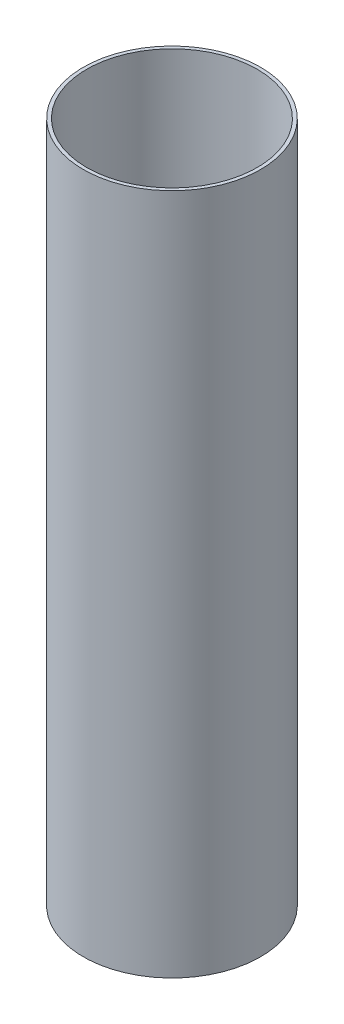
ISO-10303-21;
HEADER;
FILE_DESCRIPTION(('STEP AP214'),'2;1');
FILE_NAME('part.step','',(''),(''),'','','');
FILE_SCHEMA(('AUTOMOTIVE_DESIGN { 1 0 10303 214 1 1 1 1 }'));
ENDSEC;
DATA;
#1=APPLICATION_CONTEXT('core data for automotive mechanical design processes');
#2=APPLICATION_PROTOCOL_DEFINITION('international standard','automotive_design',2000,#1);
#3=PRODUCT_CONTEXT('',#1,'mechanical');
#4=PRODUCT('Part','Part','',(#3));
#5=PRODUCT_RELATED_PRODUCT_CATEGORY('part','',(#4));
#6=PRODUCT_DEFINITION_FORMATION('','',#4);
#7=PRODUCT_DEFINITION_CONTEXT('part definition',#1,'design');
#8=PRODUCT_DEFINITION('design','',#6,#7);
#9=PRODUCT_DEFINITION_SHAPE('','',#8);
#10=(LENGTH_UNIT() NAMED_UNIT(*) SI_UNIT(.MILLI.,.METRE.));
#11=(NAMED_UNIT(*) PLANE_ANGLE_UNIT() SI_UNIT($,.RADIAN.));
#12=(NAMED_UNIT(*) SI_UNIT($,.STERADIAN.) SOLID_ANGLE_UNIT());
#13=UNCERTAINTY_MEASURE_WITH_UNIT(LENGTH_MEASURE(1.E-05),#10,'distance_accuracy_value','');
#14=(GEOMETRIC_REPRESENTATION_CONTEXT(3) GLOBAL_UNCERTAINTY_ASSIGNED_CONTEXT((#13)) GLOBAL_UNIT_ASSIGNED_CONTEXT((#10,
#11,#12)) REPRESENTATION_CONTEXT('',''));
#15=CARTESIAN_POINT('',(0.,0.,0.));
#16=DIRECTION('',(0.,0.,1.));
#17=DIRECTION('',(1.,0.,0.));
#18=AXIS2_PLACEMENT_3D('',#15,#16,#17);
#19=CARTESIAN_POINT('',(0.,304.8,0.));
#20=DIRECTION('',(0.,1.,0.));
#21=DIRECTION('',(0.,0.,1.));
#22=AXIS2_PLACEMENT_3D('',#19,#20,#21);
#23=PLANE('',#22);
#24=CARTESIAN_POINT('',(0.,304.8,0.));
#25=DIRECTION('',(0.,1.,0.));
#26=DIRECTION('',(0.,0.,1.));
#27=AXIS2_PLACEMENT_3D('',#24,#25,#26);
#28=CIRCLE('',#27,39.624);
#29=CARTESIAN_POINT('',(0.,304.8,-39.624));
#30=VERTEX_POINT('',#29);
#31=EDGE_CURVE('E10',#30,#30,#28,.T.);
#32=ORIENTED_EDGE('',*,*,#31,.T.);
#33=EDGE_LOOP('',(#32));
#34=FACE_BOUND('',#33,.T.);
#35=CARTESIAN_POINT('',(0.,304.8,0.));
#36=DIRECTION('',(0.,1.,0.));
#37=DIRECTION('',(0.,0.,1.));
#38=AXIS2_PLACEMENT_3D('',#35,#36,#37);
#39=CIRCLE('',#38,38.1);
#40=CARTESIAN_POINT('',(0.,304.8,-38.1));
#41=VERTEX_POINT('',#40);
#42=EDGE_CURVE('E56',#41,#41,#39,.T.);
#43=ORIENTED_EDGE('',*,*,#42,.F.);
#44=EDGE_LOOP('',(#43));
#45=FACE_BOUND('',#44,.T.);
#46=ADVANCED_FACE('F43',(#34,#45),#23,.T.);
#47=CARTESIAN_POINT('',(0.,0.,0.));
#48=DIRECTION('',(0.,1.,0.));
#49=DIRECTION('',(0.,0.,1.));
#50=AXIS2_PLACEMENT_3D('',#47,#48,#49);
#51=PLANE('',#50);
#52=CARTESIAN_POINT('',(0.,0.,0.));
#53=DIRECTION('',(0.,1.,0.));
#54=DIRECTION('',(0.,0.,1.));
#55=AXIS2_PLACEMENT_3D('',#52,#53,#54);
#56=CIRCLE('',#55,39.624);
#57=CARTESIAN_POINT('',(0.,0.,-39.624));
#58=VERTEX_POINT('',#57);
#59=EDGE_CURVE('E47',#58,#58,#56,.T.);
#60=ORIENTED_EDGE('',*,*,#59,.F.);
#61=EDGE_LOOP('',(#60));
#62=FACE_BOUND('',#61,.T.);
#63=CARTESIAN_POINT('',(0.,0.,0.));
#64=DIRECTION('',(0.,1.,0.));
#65=DIRECTION('',(0.,0.,1.));
#66=AXIS2_PLACEMENT_3D('',#63,#64,#65);
#67=CIRCLE('',#66,38.1);
#68=CARTESIAN_POINT('',(0.,0.,-38.1));
#69=VERTEX_POINT('',#68);
#70=EDGE_CURVE('E58',#69,#69,#67,.T.);
#71=ORIENTED_EDGE('',*,*,#70,.T.);
#72=EDGE_LOOP('',(#71));
#73=FACE_BOUND('',#72,.T.);
#74=ADVANCED_FACE('F70',(#62,#73),#51,.F.);
#75=CARTESIAN_POINT('',(0.,304.8,0.));
#76=DIRECTION('',(0.,-1.,0.));
#77=DIRECTION('',(0.,0.,-1.));
#78=AXIS2_PLACEMENT_3D('',#75,#76,#77);
#79=CYLINDRICAL_SURFACE('',#78,39.624);
#80=CARTESIAN_POINT('',(0.,304.8,-39.624));
#81=CARTESIAN_POINT('',(0.,301.625,-39.624));
#82=CARTESIAN_POINT('',(0.,298.45,-39.624));
#83=CARTESIAN_POINT('',(0.,292.1,-39.624));
#84=CARTESIAN_POINT('',(0.,288.925,-39.624));
#85=CARTESIAN_POINT('',(0.,282.575,-39.624));
#86=CARTESIAN_POINT('',(0.,279.4,-39.624));
#87=CARTESIAN_POINT('',(0.,273.05,-39.624));
#88=CARTESIAN_POINT('',(0.,269.875,-39.624));
#89=CARTESIAN_POINT('',(0.,263.525,-39.624));
#90=CARTESIAN_POINT('',(0.,260.35,-39.624));
#91=CARTESIAN_POINT('',(0.,254.,-39.624));
#92=CARTESIAN_POINT('',(0.,250.825,-39.624));
#93=CARTESIAN_POINT('',(0.,244.475,-39.624));
#94=CARTESIAN_POINT('',(0.,241.3,-39.624));
#95=CARTESIAN_POINT('',(0.,234.95,-39.624));
#96=CARTESIAN_POINT('',(0.,231.775,-39.624));
#97=CARTESIAN_POINT('',(0.,225.425,-39.624));
#98=CARTESIAN_POINT('',(0.,222.25,-39.624));
#99=CARTESIAN_POINT('',(0.,215.9,-39.624));
#100=CARTESIAN_POINT('',(0.,212.725,-39.624));
#101=CARTESIAN_POINT('',(0.,206.375,-39.624));
#102=CARTESIAN_POINT('',(0.,203.2,-39.624));
#103=CARTESIAN_POINT('',(0.,196.85,-39.624));
#104=CARTESIAN_POINT('',(0.,193.675,-39.624));
#105=CARTESIAN_POINT('',(0.,187.325,-39.624));
#106=CARTESIAN_POINT('',(0.,184.15,-39.624));
#107=CARTESIAN_POINT('',(0.,177.8,-39.624));
#108=CARTESIAN_POINT('',(0.,174.625,-39.624));
#109=CARTESIAN_POINT('',(0.,168.275,-39.624));
#110=CARTESIAN_POINT('',(0.,165.1,-39.624));
#111=CARTESIAN_POINT('',(0.,158.75,-39.624));
#112=CARTESIAN_POINT('',(0.,155.575,-39.624));
#113=CARTESIAN_POINT('',(0.,149.225,-39.624));
#114=CARTESIAN_POINT('',(0.,146.05,-39.624));
#115=CARTESIAN_POINT('',(0.,139.7,-39.624));
#116=CARTESIAN_POINT('',(0.,136.525,-39.624));
#117=CARTESIAN_POINT('',(0.,130.175,-39.624));
#118=CARTESIAN_POINT('',(0.,127.,-39.624));
#119=CARTESIAN_POINT('',(0.,120.65,-39.624));
#120=CARTESIAN_POINT('',(0.,117.475,-39.624));
#121=CARTESIAN_POINT('',(0.,111.125,-39.624));
#122=CARTESIAN_POINT('',(0.,107.95,-39.624));
#123=CARTESIAN_POINT('',(0.,101.6,-39.624));
#124=CARTESIAN_POINT('',(0.,98.425,-39.624));
#125=CARTESIAN_POINT('',(0.,92.075,-39.624));
#126=CARTESIAN_POINT('',(0.,88.9,-39.624));
#127=CARTESIAN_POINT('',(0.,82.55,-39.624));
#128=CARTESIAN_POINT('',(0.,79.375,-39.624));
#129=CARTESIAN_POINT('',(0.,73.025,-39.624));
#130=CARTESIAN_POINT('',(0.,69.85,-39.624));
#131=CARTESIAN_POINT('',(0.,63.5,-39.624));
#132=CARTESIAN_POINT('',(0.,60.325,-39.624));
#133=CARTESIAN_POINT('',(0.,53.975,-39.624));
#134=CARTESIAN_POINT('',(0.,50.8,-39.624));
#135=CARTESIAN_POINT('',(0.,44.45,-39.624));
#136=CARTESIAN_POINT('',(0.,41.275,-39.624));
#137=CARTESIAN_POINT('',(0.,34.925,-39.624));
#138=CARTESIAN_POINT('',(0.,31.75,-39.624));
#139=CARTESIAN_POINT('',(0.,25.4,-39.624));
#140=CARTESIAN_POINT('',(0.,22.225,-39.624));
#141=CARTESIAN_POINT('',(0.,15.875,-39.624));
#142=CARTESIAN_POINT('',(0.,12.7,-39.624));
#143=CARTESIAN_POINT('',(0.,6.35,-39.624));
#144=CARTESIAN_POINT('',(0.,3.175,-39.624));
#145=CARTESIAN_POINT('',(0.,0.,-39.624));
#146=B_SPLINE_CURVE_WITH_KNOTS('',3,(#80,#81,#82,#83,#84,#85,#86,#87,#88,#89,#90,#91,#92,#93,
#94,#95,#96,#97,#98,#99,#100,#101,#102,#103,#104,#105,#106,#107,#108,#109,#110,#111,#112,#113,
#114,#115,#116,#117,#118,#119,#120,#121,#122,#123,#124,#125,#126,#127,#128,#129,#130,#131,#132,
#133,#134,#135,#136,#137,#138,#139,#140,#141,#142,#143,#144,#145),.UNSPECIFIED.,.F.,.F.,(4,2,2,
2,2,2,2,2,2,2,2,2,2,2,2,2,2,2,2,2,2,2,2,2,2,2,2,2,2,2,2,2,4),(0.,9.52500000000001,19.05,28.575,
38.1,47.625,57.15,66.675,76.2,85.7250000000001,95.2500000000001,104.775,114.3,123.825,133.35,
142.875,152.4,161.925,171.45,180.975,190.5,200.025,209.55,219.075,228.6,238.125,247.65,257.175,
266.7,276.225,285.75,295.275,304.8),.UNSPECIFIED.);
#147=EDGE_CURVE('BSEAM45',#30,#58,#146,.T.);
#148=ORIENTED_EDGE('',*,*,#31,.F.);
#149=ORIENTED_EDGE('',*,*,#59,.T.);
#150=ORIENTED_EDGE('',*,*,#147,.T.);
#151=ORIENTED_EDGE('',*,*,#147,.F.);
#152=EDGE_LOOP('',(#148,#150,#149,#151));
#153=FACE_BOUND('',#152,.T.);
#154=ADVANCED_FACE('F45',(#153),#79,.T.);
#155=CARTESIAN_POINT('',(0.,304.8,0.));
#156=DIRECTION('',(0.,-1.,0.));
#157=DIRECTION('',(0.,0.,-1.));
#158=AXIS2_PLACEMENT_3D('',#155,#156,#157);
#159=CYLINDRICAL_SURFACE('',#158,38.1);
#160=CARTESIAN_POINT('',(0.,304.8,-38.1));
#161=CARTESIAN_POINT('',(0.,301.625,-38.1));
#162=CARTESIAN_POINT('',(0.,298.45,-38.1));
#163=CARTESIAN_POINT('',(0.,292.1,-38.1));
#164=CARTESIAN_POINT('',(0.,288.925,-38.1));
#165=CARTESIAN_POINT('',(0.,282.575,-38.1));
#166=CARTESIAN_POINT('',(0.,279.4,-38.1));
#167=CARTESIAN_POINT('',(0.,273.05,-38.1));
#168=CARTESIAN_POINT('',(0.,269.875,-38.1));
#169=CARTESIAN_POINT('',(0.,263.525,-38.1));
#170=CARTESIAN_POINT('',(0.,260.35,-38.1));
#171=CARTESIAN_POINT('',(0.,254.,-38.1));
#172=CARTESIAN_POINT('',(0.,250.825,-38.1));
#173=CARTESIAN_POINT('',(0.,244.475,-38.1));
#174=CARTESIAN_POINT('',(0.,241.3,-38.1));
#175=CARTESIAN_POINT('',(0.,234.95,-38.1));
#176=CARTESIAN_POINT('',(0.,231.775,-38.1));
#177=CARTESIAN_POINT('',(0.,225.425,-38.1));
#178=CARTESIAN_POINT('',(0.,222.25,-38.1));
#179=CARTESIAN_POINT('',(0.,215.9,-38.1));
#180=CARTESIAN_POINT('',(0.,212.725,-38.1));
#181=CARTESIAN_POINT('',(0.,206.375,-38.1));
#182=CARTESIAN_POINT('',(0.,203.2,-38.1));
#183=CARTESIAN_POINT('',(0.,196.85,-38.1));
#184=CARTESIAN_POINT('',(0.,193.675,-38.1));
#185=CARTESIAN_POINT('',(0.,187.325,-38.1));
#186=CARTESIAN_POINT('',(0.,184.15,-38.1));
#187=CARTESIAN_POINT('',(0.,177.8,-38.1));
#188=CARTESIAN_POINT('',(0.,174.625,-38.1));
#189=CARTESIAN_POINT('',(0.,168.275,-38.1));
#190=CARTESIAN_POINT('',(0.,165.1,-38.1));
#191=CARTESIAN_POINT('',(0.,158.75,-38.1));
#192=CARTESIAN_POINT('',(0.,155.575,-38.1));
#193=CARTESIAN_POINT('',(0.,149.225,-38.1));
#194=CARTESIAN_POINT('',(0.,146.05,-38.1));
#195=CARTESIAN_POINT('',(0.,139.7,-38.1));
#196=CARTESIAN_POINT('',(0.,136.525,-38.1));
#197=CARTESIAN_POINT('',(0.,130.175,-38.1));
#198=CARTESIAN_POINT('',(0.,127.,-38.1));
#199=CARTESIAN_POINT('',(0.,120.65,-38.1));
#200=CARTESIAN_POINT('',(0.,117.475,-38.1));
#201=CARTESIAN_POINT('',(0.,111.125,-38.1));
#202=CARTESIAN_POINT('',(0.,107.95,-38.1));
#203=CARTESIAN_POINT('',(0.,101.6,-38.1));
#204=CARTESIAN_POINT('',(0.,98.425,-38.1));
#205=CARTESIAN_POINT('',(0.,92.075,-38.1));
#206=CARTESIAN_POINT('',(0.,88.9,-38.1));
#207=CARTESIAN_POINT('',(0.,82.55,-38.1));
#208=CARTESIAN_POINT('',(0.,79.375,-38.1));
#209=CARTESIAN_POINT('',(0.,73.025,-38.1));
#210=CARTESIAN_POINT('',(0.,69.85,-38.1));
#211=CARTESIAN_POINT('',(0.,63.5,-38.1));
#212=CARTESIAN_POINT('',(0.,60.325,-38.1));
#213=CARTESIAN_POINT('',(0.,53.975,-38.1));
#214=CARTESIAN_POINT('',(0.,50.8,-38.1));
#215=CARTESIAN_POINT('',(0.,44.45,-38.1));
#216=CARTESIAN_POINT('',(0.,41.275,-38.1));
#217=CARTESIAN_POINT('',(0.,34.925,-38.1));
#218=CARTESIAN_POINT('',(0.,31.75,-38.1));
#219=CARTESIAN_POINT('',(0.,25.4,-38.1));
#220=CARTESIAN_POINT('',(0.,22.225,-38.1));
#221=CARTESIAN_POINT('',(0.,15.875,-38.1));
#222=CARTESIAN_POINT('',(0.,12.7,-38.1));
#223=CARTESIAN_POINT('',(0.,6.35,-38.1));
#224=CARTESIAN_POINT('',(0.,3.175,-38.1));
#225=CARTESIAN_POINT('',(0.,0.,-38.1));
#226=B_SPLINE_CURVE_WITH_KNOTS('',3,(#160,#161,#162,#163,#164,#165,#166,#167,#168,#169,#170,
#171,#172,#173,#174,#175,#176,#177,#178,#179,#180,#181,#182,#183,#184,#185,#186,#187,#188,#189,
#190,#191,#192,#193,#194,#195,#196,#197,#198,#199,#200,#201,#202,#203,#204,#205,#206,#207,#208,
#209,#210,#211,#212,#213,#214,#215,#216,#217,#218,#219,#220,#221,#222,#223,#224,#225),
.UNSPECIFIED.,.F.,.F.,(4,2,2,2,2,2,2,2,2,2,2,2,2,2,2,2,2,2,2,2,2,2,2,2,2,2,2,2,2,2,2,2,4),(0.,
9.52500000000001,19.05,28.575,38.1,47.625,57.15,66.675,76.2,85.7250000000001,95.2500000000001,
104.775,114.3,123.825,133.35,142.875,152.4,161.925,171.45,180.975,190.5,200.025,209.55,219.075,
228.6,238.125,247.65,257.175,266.7,276.225,285.75,295.275,304.8),.UNSPECIFIED.);
#227=EDGE_CURVE('BSEAM66',#41,#69,#226,.T.);
#228=ORIENTED_EDGE('',*,*,#42,.T.);
#229=ORIENTED_EDGE('',*,*,#70,.F.);
#230=ORIENTED_EDGE('',*,*,#227,.T.);
#231=ORIENTED_EDGE('',*,*,#227,.F.);
#232=EDGE_LOOP('',(#228,#230,#229,#231));
#233=FACE_BOUND('',#232,.T.);
#234=ADVANCED_FACE('F66',(#233),#159,.F.);
#235=CLOSED_SHELL('',(#46,#74,#154,#234));
#236=MANIFOLD_SOLID_BREP('B2',#235);
#237=ADVANCED_BREP_SHAPE_REPRESENTATION('',(#18,#236),#14);
#238=SHAPE_DEFINITION_REPRESENTATION(#9,#237);
ENDSEC;
END-ISO-10303-21;
